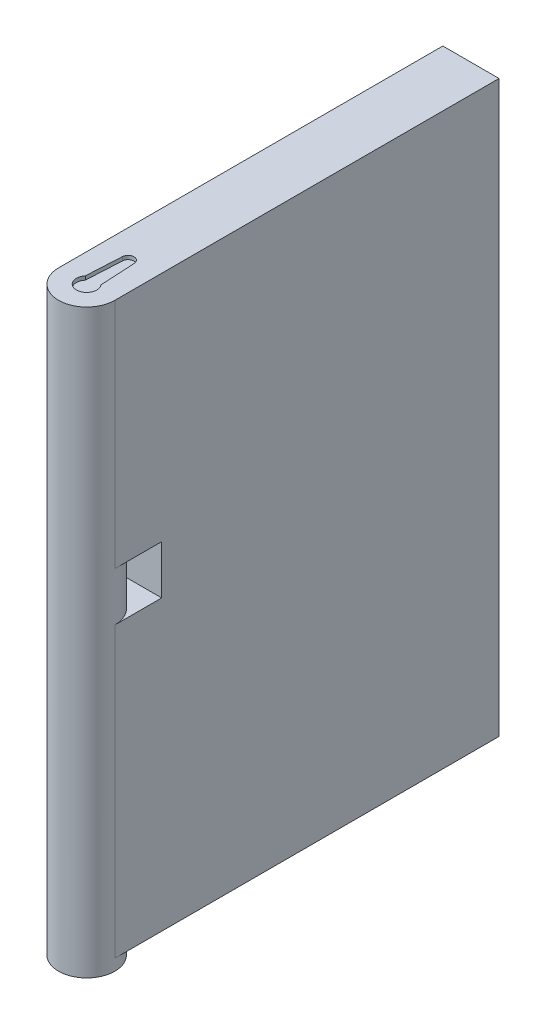
ISO-10303-21;
HEADER;
FILE_DESCRIPTION(('STEP AP214'),'2;1');
FILE_NAME('part.step','',(''),(''),'','','');
FILE_SCHEMA(('AUTOMOTIVE_DESIGN { 1 0 10303 214 1 1 1 1 }'));
ENDSEC;
DATA;
#1=APPLICATION_CONTEXT('core data for automotive mechanical design processes');
#2=APPLICATION_PROTOCOL_DEFINITION('international standard','automotive_design',2000,#1);
#3=PRODUCT_CONTEXT('',#1,'mechanical');
#4=PRODUCT('Part','Part','',(#3));
#5=PRODUCT_RELATED_PRODUCT_CATEGORY('part','',(#4));
#6=PRODUCT_DEFINITION_FORMATION('','',#4);
#7=PRODUCT_DEFINITION_CONTEXT('part definition',#1,'design');
#8=PRODUCT_DEFINITION('design','',#6,#7);
#9=PRODUCT_DEFINITION_SHAPE('','',#8);
#10=(LENGTH_UNIT() NAMED_UNIT(*) SI_UNIT(.MILLI.,.METRE.));
#11=(NAMED_UNIT(*) PLANE_ANGLE_UNIT() SI_UNIT($,.RADIAN.));
#12=(NAMED_UNIT(*) SI_UNIT($,.STERADIAN.) SOLID_ANGLE_UNIT());
#13=UNCERTAINTY_MEASURE_WITH_UNIT(LENGTH_MEASURE(1.E-05),#10,'distance_accuracy_value','');
#14=(GEOMETRIC_REPRESENTATION_CONTEXT(3) GLOBAL_UNCERTAINTY_ASSIGNED_CONTEXT((#13)) GLOBAL_UNIT_ASSIGNED_CONTEXT((#10,
#11,#12)) REPRESENTATION_CONTEXT('',''));
#15=CARTESIAN_POINT('',(0.,0.,0.));
#16=DIRECTION('',(0.,0.,1.));
#17=DIRECTION('',(1.,0.,0.));
#18=AXIS2_PLACEMENT_3D('',#15,#16,#17);
#19=CARTESIAN_POINT('',(9.525,96.52,0.));
#20=DIRECTION('',(-1.,0.,0.));
#21=DIRECTION('',(0.,0.,1.));
#22=AXIS2_PLACEMENT_3D('',#19,#20,#21);
#23=PLANE('',#22);
#24=DIRECTION('',(0.,0.,-1.));
#25=VECTOR('',#24,1.);
#26=CARTESIAN_POINT('',(9.52499999999998,1.27000000000009,-3.17500000000008));
#27=LINE('',#26,#25);
#28=CARTESIAN_POINT('',(9.525,1.27000000000009,60.325));
#29=VERTEX_POINT('',#28);
#30=CARTESIAN_POINT('',(9.52500000000001,1.27000000000009,44.45));
#31=VERTEX_POINT('',#30);
#32=EDGE_CURVE('E140',#29,#31,#27,.T.);
#33=ORIENTED_EDGE('',*,*,#32,.F.);
#34=DIRECTION('',(0.,-1.,0.));
#35=VECTOR('',#34,1.);
#36=CARTESIAN_POINT('',(9.525,96.52,60.325));
#37=LINE('',#36,#35);
#38=CARTESIAN_POINT('',(9.525,-96.52,60.325));
#39=VERTEX_POINT('',#38);
#40=EDGE_CURVE('E137',#29,#39,#37,.T.);
#41=ORIENTED_EDGE('',*,*,#40,.T.);
#42=DIRECTION('',(0.,0.,-1.));
#43=VECTOR('',#42,1.);
#44=CARTESIAN_POINT('',(9.525,-96.52,0.));
#45=LINE('',#44,#43);
#46=CARTESIAN_POINT('',(9.525,-96.52,-69.85));
#47=VERTEX_POINT('',#46);
#48=EDGE_CURVE('E230',#39,#47,#45,.T.);
#49=ORIENTED_EDGE('',*,*,#48,.T.);
#50=DIRECTION('',(0.,-1.,0.));
#51=VECTOR('',#50,1.);
#52=CARTESIAN_POINT('',(9.525,96.52,-69.85));
#53=LINE('',#52,#51);
#54=CARTESIAN_POINT('',(9.525,96.52,-69.85));
#55=VERTEX_POINT('',#54);
#56=EDGE_CURVE('E166',#55,#47,#53,.T.);
#57=ORIENTED_EDGE('',*,*,#56,.F.);
#58=DIRECTION('',(0.,0.,-1.));
#59=VECTOR('',#58,1.);
#60=CARTESIAN_POINT('',(9.525,96.52,0.));
#61=LINE('',#60,#59);
#62=CARTESIAN_POINT('',(9.525,96.52,60.325));
#63=VERTEX_POINT('',#62);
#64=EDGE_CURVE('E179',#63,#55,#61,.T.);
#65=ORIENTED_EDGE('',*,*,#64,.F.);
#66=CARTESIAN_POINT('',(9.525,17.7800000000001,60.325));
#67=VERTEX_POINT('',#66);
#68=EDGE_CURVE('E47',#63,#67,#37,.T.);
#69=ORIENTED_EDGE('',*,*,#68,.T.);
#70=DIRECTION('',(0.,0.,-1.));
#71=VECTOR('',#70,1.);
#72=CARTESIAN_POINT('',(9.52499999999998,17.7800000000001,-3.17500000000008));
#73=LINE('',#72,#71);
#74=CARTESIAN_POINT('',(9.525,17.7800000000001,44.45));
#75=VERTEX_POINT('',#74);
#76=EDGE_CURVE('E178',#67,#75,#73,.T.);
#77=ORIENTED_EDGE('',*,*,#76,.T.);
#78=DIRECTION('',(0.,1.,0.));
#79=VECTOR('',#78,1.);
#80=CARTESIAN_POINT('',(9.52500000000001,1.27000000000009,44.45));
#81=LINE('',#80,#79);
#82=EDGE_CURVE('E195',#31,#75,#81,.T.);
#83=ORIENTED_EDGE('',*,*,#82,.F.);
#84=EDGE_LOOP('',(#33,#41,#49,#57,#65,#69,#77,#83));
#85=FACE_BOUND('',#84,.T.);
#86=ADVANCED_FACE('F43',(#85),#23,.F.);
#87=CARTESIAN_POINT('',(-9.525,96.52,0.));
#88=DIRECTION('',(-1.,0.,0.));
#89=DIRECTION('',(0.,0.,1.));
#90=AXIS2_PLACEMENT_3D('',#87,#88,#89);
#91=PLANE('',#90);
#92=DIRECTION('',(0.,-1.,0.));
#93=VECTOR('',#92,1.);
#94=CARTESIAN_POINT('',(-9.525,96.52,60.325));
#95=LINE('',#94,#93);
#96=CARTESIAN_POINT('',(-9.525,1.27000000000009,60.325));
#97=VERTEX_POINT('',#96);
#98=CARTESIAN_POINT('',(-9.525,-96.52,60.325));
#99=VERTEX_POINT('',#98);
#100=EDGE_CURVE('E135',#97,#99,#95,.T.);
#101=ORIENTED_EDGE('',*,*,#100,.F.);
#102=DIRECTION('',(0.,0.,1.));
#103=VECTOR('',#102,1.);
#104=CARTESIAN_POINT('',(-9.52500000000001,1.27000000000009,-3.17500000000017));
#105=LINE('',#104,#103);
#106=CARTESIAN_POINT('',(-9.52500000000001,1.27000000000009,44.45));
#107=VERTEX_POINT('',#106);
#108=EDGE_CURVE('E141',#107,#97,#105,.T.);
#109=ORIENTED_EDGE('',*,*,#108,.F.);
#110=DIRECTION('',(0.,1.,0.));
#111=VECTOR('',#110,1.);
#112=CARTESIAN_POINT('',(-9.52500000000001,1.27000000000009,44.45));
#113=LINE('',#112,#111);
#114=CARTESIAN_POINT('',(-9.52500000000001,17.7800000000001,44.45));
#115=VERTEX_POINT('',#114);
#116=EDGE_CURVE('E192',#107,#115,#113,.T.);
#117=ORIENTED_EDGE('',*,*,#116,.T.);
#118=DIRECTION('',(0.,0.,1.));
#119=VECTOR('',#118,1.);
#120=CARTESIAN_POINT('',(-9.52500000000001,17.7800000000001,-3.17500000000017));
#121=LINE('',#120,#119);
#122=CARTESIAN_POINT('',(-9.525,17.7800000000001,60.325));
#123=VERTEX_POINT('',#122);
#124=EDGE_CURVE('E185',#115,#123,#121,.T.);
#125=ORIENTED_EDGE('',*,*,#124,.T.);
#126=CARTESIAN_POINT('',(-9.525,96.52,60.325));
#127=VERTEX_POINT('',#126);
#128=EDGE_CURVE('E155',#127,#123,#95,.T.);
#129=ORIENTED_EDGE('',*,*,#128,.F.);
#130=DIRECTION('',(0.,0.,-1.));
#131=VECTOR('',#130,1.);
#132=CARTESIAN_POINT('',(-9.525,96.52,0.));
#133=LINE('',#132,#131);
#134=CARTESIAN_POINT('',(-9.525,96.52,-69.85));
#135=VERTEX_POINT('',#134);
#136=EDGE_CURVE('E156',#127,#135,#133,.T.);
#137=ORIENTED_EDGE('',*,*,#136,.T.);
#138=DIRECTION('',(0.,-1.,0.));
#139=VECTOR('',#138,1.);
#140=CARTESIAN_POINT('',(-9.525,96.52,-69.85));
#141=LINE('',#140,#139);
#142=CARTESIAN_POINT('',(-9.525,-96.52,-69.85));
#143=VERTEX_POINT('',#142);
#144=EDGE_CURVE('E159',#135,#143,#141,.T.);
#145=ORIENTED_EDGE('',*,*,#144,.T.);
#146=DIRECTION('',(0.,0.,-1.));
#147=VECTOR('',#146,1.);
#148=CARTESIAN_POINT('',(-9.525,-96.52,0.));
#149=LINE('',#148,#147);
#150=EDGE_CURVE('E154',#99,#143,#149,.T.);
#151=ORIENTED_EDGE('',*,*,#150,.F.);
#152=EDGE_LOOP('',(#101,#109,#117,#125,#129,#137,#145,#151));
#153=FACE_BOUND('',#152,.T.);
#154=ADVANCED_FACE('F152',(#153),#91,.T.);
#155=CARTESIAN_POINT('',(0.,96.52,60.325));
#156=DIRECTION('',(0.,-1.,0.));
#157=DIRECTION('',(0.,0.,-1.));
#158=AXIS2_PLACEMENT_3D('',#155,#156,#157);
#159=CYLINDRICAL_SURFACE('',#158,9.525);
#160=CARTESIAN_POINT('',(0.,17.7800000000001,60.325));
#161=DIRECTION('',(0.,1.,0.));
#162=DIRECTION('',(0.,0.,1.));
#163=AXIS2_PLACEMENT_3D('',#160,#161,#162);
#164=CIRCLE('',#163,9.525);
#165=EDGE_CURVE('E64',#67,#123,#164,.T.);
#166=ORIENTED_EDGE('',*,*,#165,.F.);
#167=ORIENTED_EDGE('',*,*,#68,.F.);
#168=CARTESIAN_POINT('',(0.,96.52,60.325));
#169=DIRECTION('',(0.,1.,0.));
#170=DIRECTION('',(0.,0.,1.));
#171=AXIS2_PLACEMENT_3D('',#168,#169,#170);
#172=CIRCLE('',#171,9.525);
#173=EDGE_CURVE('E183',#127,#63,#172,.T.);
#174=ORIENTED_EDGE('',*,*,#173,.F.);
#175=ORIENTED_EDGE('',*,*,#128,.T.);
#176=EDGE_LOOP('',(#166,#167,#174,#175));
#177=FACE_BOUND('',#176,.T.);
#178=ORIENTED_EDGE('',*,*,#40,.F.);
#179=CARTESIAN_POINT('',(0.,1.27000000000009,60.325));
#180=DIRECTION('',(0.,1.,0.));
#181=DIRECTION('',(0.,0.,1.));
#182=AXIS2_PLACEMENT_3D('',#179,#180,#181);
#183=CIRCLE('',#182,9.525);
#184=EDGE_CURVE('E131',#29,#97,#183,.T.);
#185=ORIENTED_EDGE('',*,*,#184,.T.);
#186=ORIENTED_EDGE('',*,*,#100,.T.);
#187=CARTESIAN_POINT('',(0.,-96.52,60.325));
#188=DIRECTION('',(0.,-1.,0.));
#189=DIRECTION('',(0.,0.,-1.));
#190=AXIS2_PLACEMENT_3D('',#187,#188,#189);
#191=CIRCLE('',#190,9.525);
#192=EDGE_CURVE('E11',#99,#39,#191,.T.);
#193=ORIENTED_EDGE('',*,*,#192,.T.);
#194=EDGE_LOOP('',(#178,#185,#186,#193));
#195=FACE_BOUND('',#194,.T.);
#196=CARTESIAN_POINT('',(0.,-100.33,60.325));
#197=DIRECTION('',(0.,-1.,0.));
#198=DIRECTION('',(0.,0.,-1.));
#199=AXIS2_PLACEMENT_3D('',#196,#197,#198);
#200=CIRCLE('',#199,9.525);
#201=CARTESIAN_POINT('',(0.,-100.33,50.8));
#202=VERTEX_POINT('',#201);
#203=EDGE_CURVE('E222',#202,#202,#200,.T.);
#204=ORIENTED_EDGE('',*,*,#203,.F.);
#205=EDGE_LOOP('',(#204));
#206=FACE_BOUND('',#205,.T.);
#207=ADVANCED_FACE('F45',(#177,#195,#206),#159,.T.);
#208=CARTESIAN_POINT('',(0.,96.52,-69.85));
#209=DIRECTION('',(0.,0.,-1.));
#210=DIRECTION('',(-1.,0.,0.));
#211=AXIS2_PLACEMENT_3D('',#208,#209,#210);
#212=PLANE('',#211);
#213=DIRECTION('',(1.,0.,0.));
#214=VECTOR('',#213,1.);
#215=CARTESIAN_POINT('',(0.,-96.52,-69.85));
#216=LINE('',#215,#214);
#217=EDGE_CURVE('E235',#143,#47,#216,.T.);
#218=ORIENTED_EDGE('',*,*,#217,.F.);
#219=ORIENTED_EDGE('',*,*,#144,.F.);
#220=DIRECTION('',(1.,0.,0.));
#221=VECTOR('',#220,1.);
#222=CARTESIAN_POINT('',(0.,96.52,-69.85));
#223=LINE('',#222,#221);
#224=EDGE_CURVE('E161',#135,#55,#223,.T.);
#225=ORIENTED_EDGE('',*,*,#224,.T.);
#226=ORIENTED_EDGE('',*,*,#56,.T.);
#227=EDGE_LOOP('',(#218,#219,#225,#226));
#228=FACE_BOUND('',#227,.T.);
#229=ADVANCED_FACE('F240',(#228),#212,.T.);
#230=CARTESIAN_POINT('',(0.,96.52,0.));
#231=DIRECTION('',(0.,1.,0.));
#232=DIRECTION('',(0.,0.,1.));
#233=AXIS2_PLACEMENT_3D('',#230,#231,#232);
#234=PLANE('',#233);
#235=CARTESIAN_POINT('',(-0.00400000000339023,96.52,60.3470000000013));
#236=DIRECTION('',(0.,1.,0.));
#237=DIRECTION('',(0.,0.,1.));
#238=AXIS2_PLACEMENT_3D('',#235,#236,#237);
#239=CIRCLE('',#238,3.45);
#240=CARTESIAN_POINT('',(-2.6539100547741,96.52,58.1378199028555));
#241=VERTEX_POINT('',#240);
#242=CARTESIAN_POINT('',(2.6460899408329,96.52,58.1380356939342));
#243=VERTEX_POINT('',#242);
#244=EDGE_CURVE('E194',#241,#243,#239,.T.);
#245=ORIENTED_EDGE('',*,*,#244,.F.);
#246=DIRECTION('',(-0.054601638125852,0.,0.998508217849995));
#247=VECTOR('',#246,1.);
#248=CARTESIAN_POINT('',(-2.6539100547741,96.52,58.1378199028555));
#249=LINE('',#248,#247);
#250=CARTESIAN_POINT('',(-2.00044438576822,96.52,46.1877967353952));
#251=VERTEX_POINT('',#250);
#252=EDGE_CURVE('E201',#251,#241,#249,.T.);
#253=ORIENTED_EDGE('',*,*,#252,.F.);
#254=CARTESIAN_POINT('',(-0.00342795006822856,96.52,46.2970000116469));
#255=DIRECTION('',(0.,1.,0.));
#256=DIRECTION('',(0.,0.,1.));
#257=AXIS2_PLACEMENT_3D('',#254,#255,#256);
#258=CIRCLE('',#257,2.);
#259=CARTESIAN_POINT('',(1.99359737149855,96.52,46.1879593539952));
#260=VERTEX_POINT('',#259);
#261=EDGE_CURVE('E215',#260,#251,#258,.T.);
#262=ORIENTED_EDGE('',*,*,#261,.F.);
#263=DIRECTION('',(-0.0545203288258459,0.,-0.998512660783388));
#264=VECTOR('',#263,1.);
#265=CARTESIAN_POINT('',(1.99359737149855,96.52,46.1879593539952));
#266=LINE('',#265,#264);
#267=EDGE_CURVE('E212',#243,#260,#266,.T.);
#268=ORIENTED_EDGE('',*,*,#267,.F.);
#269=EDGE_LOOP('',(#245,#253,#262,#268));
#270=FACE_BOUND('',#269,.T.);
#271=ORIENTED_EDGE('',*,*,#173,.T.);
#272=ORIENTED_EDGE('',*,*,#64,.T.);
#273=ORIENTED_EDGE('',*,*,#224,.F.);
#274=ORIENTED_EDGE('',*,*,#136,.F.);
#275=EDGE_LOOP('',(#271,#272,#273,#274));
#276=FACE_BOUND('',#275,.T.);
#277=ADVANCED_FACE('F242',(#270,#276),#234,.T.);
#278=CARTESIAN_POINT('',(0.,-96.52,0.));
#279=DIRECTION('',(0.,1.,0.));
#280=DIRECTION('',(0.,0.,1.));
#281=AXIS2_PLACEMENT_3D('',#278,#279,#280);
#282=PLANE('',#281);
#283=ORIENTED_EDGE('',*,*,#192,.F.);
#284=ORIENTED_EDGE('',*,*,#150,.T.);
#285=ORIENTED_EDGE('',*,*,#217,.T.);
#286=ORIENTED_EDGE('',*,*,#48,.F.);
#287=EDGE_LOOP('',(#283,#284,#285,#286));
#288=FACE_BOUND('',#287,.T.);
#289=ADVANCED_FACE('F238',(#288),#282,.F.);
#290=CARTESIAN_POINT('',(0.,-100.33,60.325));
#291=DIRECTION('',(0.,-1.,0.));
#292=DIRECTION('',(0.,0.,-1.));
#293=AXIS2_PLACEMENT_3D('',#290,#291,#292);
#294=PLANE('',#293);
#295=ORIENTED_EDGE('',*,*,#203,.T.);
#296=EDGE_LOOP('',(#295));
#297=FACE_BOUND('',#296,.T.);
#298=ADVANCED_FACE('F270',(#297),#294,.T.);
#299=CARTESIAN_POINT('',(-0.00400000000339023,95.25,60.3470000000013));
#300=DIRECTION('',(0.,1.,0.));
#301=DIRECTION('',(0.,0.,1.));
#302=AXIS2_PLACEMENT_3D('',#299,#300,#301);
#303=CYLINDRICAL_SURFACE('',#302,3.45);
#304=ORIENTED_EDGE('',*,*,#244,.T.);
#305=DIRECTION('',(0.,1.,0.));
#306=VECTOR('',#305,1.);
#307=CARTESIAN_POINT('',(2.6460899408329,95.25,58.1380356939342));
#308=LINE('',#307,#306);
#309=CARTESIAN_POINT('',(2.6460899408329,95.25,58.1380356939342));
#310=VERTEX_POINT('',#309);
#311=EDGE_CURVE('E210',#310,#243,#308,.T.);
#312=ORIENTED_EDGE('',*,*,#311,.F.);
#313=CARTESIAN_POINT('',(-0.00400000000339023,95.25,60.3470000000013));
#314=DIRECTION('',(0.,1.,0.));
#315=DIRECTION('',(0.,0.,1.));
#316=AXIS2_PLACEMENT_3D('',#313,#314,#315);
#317=CIRCLE('',#316,3.45);
#318=CARTESIAN_POINT('',(-2.6539100547741,95.25,58.1378199028555));
#319=VERTEX_POINT('',#318);
#320=EDGE_CURVE('E197',#319,#310,#317,.T.);
#321=ORIENTED_EDGE('',*,*,#320,.F.);
#322=DIRECTION('',(0.,1.,0.));
#323=VECTOR('',#322,1.);
#324=CARTESIAN_POINT('',(-2.6539100547741,95.25,58.1378199028555));
#325=LINE('',#324,#323);
#326=EDGE_CURVE('E220',#319,#241,#325,.T.);
#327=ORIENTED_EDGE('',*,*,#326,.T.);
#328=EDGE_LOOP('',(#304,#312,#321,#327));
#329=FACE_BOUND('',#328,.T.);
#330=ADVANCED_FACE('F276',(#329),#303,.F.);
#331=CARTESIAN_POINT('',(-2.6539100547741,95.25,58.1378199028555));
#332=DIRECTION('',(-0.998508217849995,0.,-0.054601638125852));
#333=DIRECTION('',(-0.054601638125852,0.,0.998508217849995));
#334=AXIS2_PLACEMENT_3D('',#331,#332,#333);
#335=PLANE('',#334);
#336=ORIENTED_EDGE('',*,*,#252,.T.);
#337=ORIENTED_EDGE('',*,*,#326,.F.);
#338=DIRECTION('',(-0.054601638125852,0.,0.998508217849995));
#339=VECTOR('',#338,1.);
#340=CARTESIAN_POINT('',(-2.6539100547741,95.25,58.1378199028555));
#341=LINE('',#340,#339);
#342=CARTESIAN_POINT('',(-2.00044438576822,95.25,46.1877967353952));
#343=VERTEX_POINT('',#342);
#344=EDGE_CURVE('E207',#343,#319,#341,.T.);
#345=ORIENTED_EDGE('',*,*,#344,.F.);
#346=DIRECTION('',(0.,1.,0.));
#347=VECTOR('',#346,1.);
#348=CARTESIAN_POINT('',(-2.00044438576822,95.25,46.1877967353952));
#349=LINE('',#348,#347);
#350=EDGE_CURVE('E223',#343,#251,#349,.T.);
#351=ORIENTED_EDGE('',*,*,#350,.T.);
#352=EDGE_LOOP('',(#336,#337,#345,#351));
#353=FACE_BOUND('',#352,.T.);
#354=ADVANCED_FACE('F280',(#353),#335,.F.);
#355=CARTESIAN_POINT('',(-0.00342795006822856,95.25,46.2970000116469));
#356=DIRECTION('',(0.,1.,0.));
#357=DIRECTION('',(0.,0.,1.));
#358=AXIS2_PLACEMENT_3D('',#355,#356,#357);
#359=CYLINDRICAL_SURFACE('',#358,2.);
#360=ORIENTED_EDGE('',*,*,#261,.T.);
#361=ORIENTED_EDGE('',*,*,#350,.F.);
#362=CARTESIAN_POINT('',(-0.00342795006822856,95.25,46.2970000116469));
#363=DIRECTION('',(0.,1.,0.));
#364=DIRECTION('',(0.,0.,1.));
#365=AXIS2_PLACEMENT_3D('',#362,#363,#364);
#366=CIRCLE('',#365,2.);
#367=CARTESIAN_POINT('',(1.99359737149855,95.25,46.1879593539952));
#368=VERTEX_POINT('',#367);
#369=EDGE_CURVE('E204',#368,#343,#366,.T.);
#370=ORIENTED_EDGE('',*,*,#369,.F.);
#371=DIRECTION('',(0.,1.,0.));
#372=VECTOR('',#371,1.);
#373=CARTESIAN_POINT('',(1.99359737149855,95.25,46.1879593539952));
#374=LINE('',#373,#372);
#375=EDGE_CURVE('E225',#368,#260,#374,.T.);
#376=ORIENTED_EDGE('',*,*,#375,.T.);
#377=EDGE_LOOP('',(#360,#361,#370,#376));
#378=FACE_BOUND('',#377,.T.);
#379=ADVANCED_FACE('F284',(#378),#359,.F.);
#380=CARTESIAN_POINT('',(1.99359737149855,95.25,46.1879593539952));
#381=DIRECTION('',(0.998512660783388,0.,-0.0545203288258459));
#382=DIRECTION('',(-0.0545203288258459,0.,-0.998512660783388));
#383=AXIS2_PLACEMENT_3D('',#380,#381,#382);
#384=PLANE('',#383);
#385=ORIENTED_EDGE('',*,*,#267,.T.);
#386=ORIENTED_EDGE('',*,*,#375,.F.);
#387=DIRECTION('',(-0.0545203288258459,0.,-0.998512660783388));
#388=VECTOR('',#387,1.);
#389=CARTESIAN_POINT('',(1.99359737149855,95.25,46.1879593539952));
#390=LINE('',#389,#388);
#391=EDGE_CURVE('E200',#310,#368,#390,.T.);
#392=ORIENTED_EDGE('',*,*,#391,.F.);
#393=ORIENTED_EDGE('',*,*,#311,.T.);
#394=EDGE_LOOP('',(#385,#386,#392,#393));
#395=FACE_BOUND('',#394,.T.);
#396=ADVANCED_FACE('F256',(#395),#384,.F.);
#397=CARTESIAN_POINT('',(-0.00400000000339023,95.25,60.3470000000013));
#398=DIRECTION('',(0.,1.,0.));
#399=DIRECTION('',(0.,0.,1.));
#400=AXIS2_PLACEMENT_3D('',#397,#398,#399);
#401=PLANE('',#400);
#402=ORIENTED_EDGE('',*,*,#320,.T.);
#403=ORIENTED_EDGE('',*,*,#391,.T.);
#404=ORIENTED_EDGE('',*,*,#369,.T.);
#405=ORIENTED_EDGE('',*,*,#344,.T.);
#406=EDGE_LOOP('',(#402,#403,#404,#405));
#407=FACE_BOUND('',#406,.T.);
#408=ADVANCED_FACE('F248',(#407),#401,.T.);
#409=CARTESIAN_POINT('',(215.9,1.27000000000009,44.45));
#410=DIRECTION('',(0.,0.,-1.));
#411=DIRECTION('',(-1.,0.,0.));
#412=AXIS2_PLACEMENT_3D('',#409,#410,#411);
#413=PLANE('',#412);
#414=DIRECTION('',(-1.,0.,0.));
#415=VECTOR('',#414,1.);
#416=CARTESIAN_POINT('',(215.9,17.7800000000001,44.45));
#417=LINE('',#416,#415);
#418=EDGE_CURVE('E59',#75,#115,#417,.T.);
#419=ORIENTED_EDGE('',*,*,#418,.T.);
#420=ORIENTED_EDGE('',*,*,#116,.F.);
#421=DIRECTION('',(-1.,0.,0.));
#422=VECTOR('',#421,1.);
#423=CARTESIAN_POINT('',(215.9,1.27000000000009,44.45));
#424=LINE('',#423,#422);
#425=EDGE_CURVE('E147',#31,#107,#424,.T.);
#426=ORIENTED_EDGE('',*,*,#425,.F.);
#427=ORIENTED_EDGE('',*,*,#82,.T.);
#428=EDGE_LOOP('',(#419,#420,#426,#427));
#429=FACE_BOUND('',#428,.T.);
#430=ADVANCED_FACE('F246',(#429),#413,.F.);
#431=CARTESIAN_POINT('',(0.,1.27000000000009,60.325));
#432=DIRECTION('',(0.,1.,0.));
#433=DIRECTION('',(0.,0.,1.));
#434=AXIS2_PLACEMENT_3D('',#431,#432,#433);
#435=PLANE('',#434);
#436=ORIENTED_EDGE('',*,*,#108,.T.);
#437=ORIENTED_EDGE('',*,*,#184,.F.);
#438=ORIENTED_EDGE('',*,*,#32,.T.);
#439=ORIENTED_EDGE('',*,*,#425,.T.);
#440=EDGE_LOOP('',(#436,#437,#438,#439));
#441=FACE_BOUND('',#440,.T.);
#442=ADVANCED_FACE('F145',(#441),#435,.T.);
#443=CARTESIAN_POINT('',(0.,17.7800000000001,60.325));
#444=DIRECTION('',(0.,1.,0.));
#445=DIRECTION('',(0.,0.,1.));
#446=AXIS2_PLACEMENT_3D('',#443,#444,#445);
#447=PLANE('',#446);
#448=ORIENTED_EDGE('',*,*,#124,.F.);
#449=ORIENTED_EDGE('',*,*,#418,.F.);
#450=ORIENTED_EDGE('',*,*,#76,.F.);
#451=ORIENTED_EDGE('',*,*,#165,.T.);
#452=EDGE_LOOP('',(#448,#449,#450,#451));
#453=FACE_BOUND('',#452,.T.);
#454=ADVANCED_FACE('F187',(#453),#447,.F.);
#455=CLOSED_SHELL('',(#86,#154,#207,#229,#277,#289,#298,#330,#354,#379,#396,#408,#430,#442,#454));
#456=MANIFOLD_SOLID_BREP('B2',#455);
#457=ADVANCED_BREP_SHAPE_REPRESENTATION('',(#18,#456),#14);
#458=SHAPE_DEFINITION_REPRESENTATION(#9,#457);
ENDSEC;
END-ISO-10303-21;
